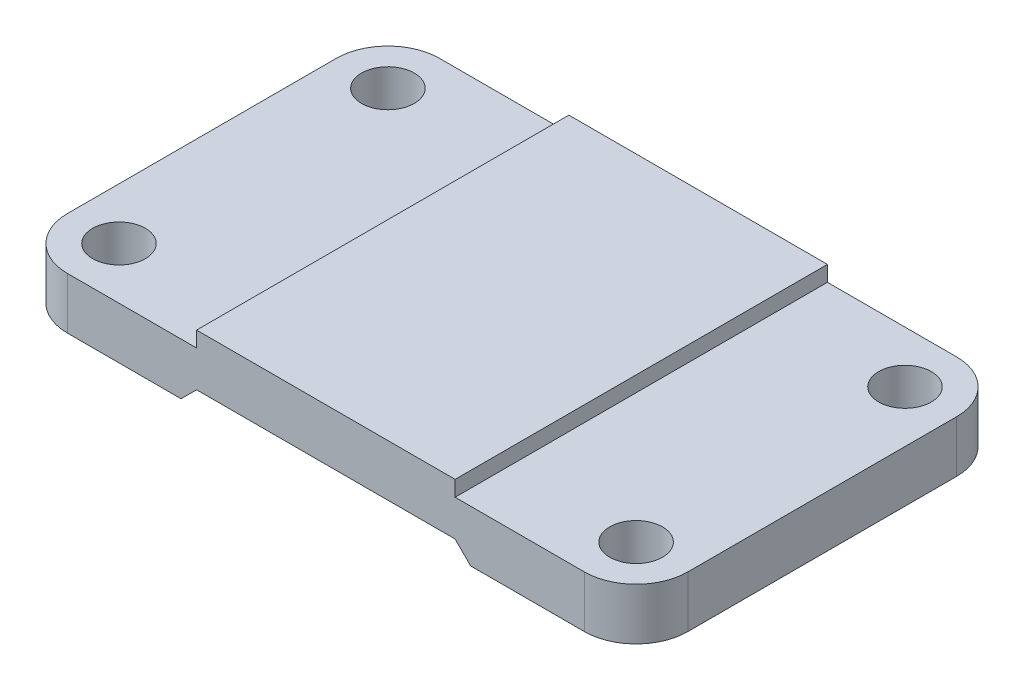
ISO-10303-21;
HEADER;
FILE_DESCRIPTION(('STEP AP214'),'2;1');
FILE_NAME('part.step','',(''),(''),'','','');
FILE_SCHEMA(('AUTOMOTIVE_DESIGN { 1 0 10303 214 1 1 1 1 }'));
ENDSEC;
DATA;
#1=APPLICATION_CONTEXT('core data for automotive mechanical design processes');
#2=APPLICATION_PROTOCOL_DEFINITION('international standard','automotive_design',2000,#1);
#3=PRODUCT_CONTEXT('',#1,'mechanical');
#4=PRODUCT('Part','Part','',(#3));
#5=PRODUCT_RELATED_PRODUCT_CATEGORY('part','',(#4));
#6=PRODUCT_DEFINITION_FORMATION('','',#4);
#7=PRODUCT_DEFINITION_CONTEXT('part definition',#1,'design');
#8=PRODUCT_DEFINITION('design','',#6,#7);
#9=PRODUCT_DEFINITION_SHAPE('','',#8);
#10=(LENGTH_UNIT() NAMED_UNIT(*) SI_UNIT(.MILLI.,.METRE.));
#11=(NAMED_UNIT(*) PLANE_ANGLE_UNIT() SI_UNIT($,.RADIAN.));
#12=(NAMED_UNIT(*) SI_UNIT($,.STERADIAN.) SOLID_ANGLE_UNIT());
#13=UNCERTAINTY_MEASURE_WITH_UNIT(LENGTH_MEASURE(1.E-05),#10,'distance_accuracy_value','');
#14=(GEOMETRIC_REPRESENTATION_CONTEXT(3) GLOBAL_UNCERTAINTY_ASSIGNED_CONTEXT((#13)) GLOBAL_UNIT_ASSIGNED_CONTEXT((#10,
#11,#12)) REPRESENTATION_CONTEXT('',''));
#15=CARTESIAN_POINT('',(0.,0.,0.));
#16=DIRECTION('',(0.,0.,1.));
#17=DIRECTION('',(1.,0.,0.));
#18=AXIS2_PLACEMENT_3D('',#15,#16,#17);
#19=CARTESIAN_POINT('',(0.,0.,0.));
#20=DIRECTION('',(0.,-1.,0.));
#21=DIRECTION('',(0.,0.,-1.));
#22=AXIS2_PLACEMENT_3D('',#19,#20,#21);
#23=PLANE('',#22);
#24=DIRECTION('',(0.,0.,1.));
#25=VECTOR('',#24,1.);
#26=CARTESIAN_POINT('',(-28.,0.,-36.));
#27=LINE('',#26,#25);
#28=CARTESIAN_POINT('',(-28.,0.,-36.));
#29=VERTEX_POINT('',#28);
#30=CARTESIAN_POINT('',(-28.,0.,36.));
#31=VERTEX_POINT('',#30);
#32=EDGE_CURVE('E227',#29,#31,#27,.T.);
#33=ORIENTED_EDGE('',*,*,#32,.T.);
#34=DIRECTION('',(1.,0.,0.));
#35=VECTOR('',#34,1.);
#36=CARTESIAN_POINT('',(-60.,0.,36.));
#37=LINE('',#36,#35);
#38=CARTESIAN_POINT('',(-50.,0.,36.));
#39=VERTEX_POINT('',#38);
#40=EDGE_CURVE('E174',#39,#31,#37,.T.);
#41=ORIENTED_EDGE('',*,*,#40,.F.);
#42=CARTESIAN_POINT('',(-50.,0.,26.));
#43=DIRECTION('',(0.,-1.,0.));
#44=DIRECTION('',(0.,0.,-1.));
#45=AXIS2_PLACEMENT_3D('',#42,#43,#44);
#46=CIRCLE('',#45,10.);
#47=CARTESIAN_POINT('',(-60.,0.,26.));
#48=VERTEX_POINT('',#47);
#49=EDGE_CURVE('E189',#39,#48,#46,.T.);
#50=ORIENTED_EDGE('',*,*,#49,.T.);
#51=DIRECTION('',(0.,0.,1.));
#52=VECTOR('',#51,1.);
#53=CARTESIAN_POINT('',(-60.,0.,36.));
#54=LINE('',#53,#52);
#55=CARTESIAN_POINT('',(-60.,0.,-26.));
#56=VERTEX_POINT('',#55);
#57=EDGE_CURVE('E175',#56,#48,#54,.T.);
#58=ORIENTED_EDGE('',*,*,#57,.F.);
#59=CARTESIAN_POINT('',(-50.,0.,-26.));
#60=DIRECTION('',(0.,-1.,0.));
#61=DIRECTION('',(0.,0.,-1.));
#62=AXIS2_PLACEMENT_3D('',#59,#60,#61);
#63=CIRCLE('',#62,10.);
#64=CARTESIAN_POINT('',(-50.,0.,-36.));
#65=VERTEX_POINT('',#64);
#66=EDGE_CURVE('E194',#56,#65,#63,.T.);
#67=ORIENTED_EDGE('',*,*,#66,.T.);
#68=DIRECTION('',(-1.,0.,0.));
#69=VECTOR('',#68,1.);
#70=CARTESIAN_POINT('',(-60.,0.,-36.));
#71=LINE('',#70,#69);
#72=EDGE_CURVE('E228',#29,#65,#71,.T.);
#73=ORIENTED_EDGE('',*,*,#72,.F.);
#74=EDGE_LOOP('',(#33,#41,#50,#58,#67,#73));
#75=FACE_BOUND('',#74,.T.);
#76=CARTESIAN_POINT('',(-50.,0.,26.));
#77=DIRECTION('',(0.,-1.,0.));
#78=DIRECTION('',(0.,0.,-1.));
#79=AXIS2_PLACEMENT_3D('',#76,#77,#78);
#80=CIRCLE('',#79,6.025);
#81=CARTESIAN_POINT('',(-50.,0.,19.975));
#82=VERTEX_POINT('',#81);
#83=EDGE_CURVE('E290',#82,#82,#80,.T.);
#84=ORIENTED_EDGE('',*,*,#83,.F.);
#85=EDGE_LOOP('',(#84));
#86=FACE_BOUND('',#85,.T.);
#87=CARTESIAN_POINT('',(-50.,0.,-26.));
#88=DIRECTION('',(0.,-1.,0.));
#89=DIRECTION('',(0.,0.,-1.));
#90=AXIS2_PLACEMENT_3D('',#87,#88,#89);
#91=CIRCLE('',#90,6.025);
#92=CARTESIAN_POINT('',(-50.,0.,-32.025));
#93=VERTEX_POINT('',#92);
#94=EDGE_CURVE('E263',#93,#93,#91,.T.);
#95=ORIENTED_EDGE('',*,*,#94,.F.);
#96=EDGE_LOOP('',(#95));
#97=FACE_BOUND('',#96,.T.);
#98=ADVANCED_FACE('F37',(#75,#86,#97),#23,.T.);
#99=CARTESIAN_POINT('',(0.,10.,0.));
#100=DIRECTION('',(0.,-1.,0.));
#101=DIRECTION('',(0.,0.,-1.));
#102=AXIS2_PLACEMENT_3D('',#99,#100,#101);
#103=PLANE('',#102);
#104=CARTESIAN_POINT('',(50.,10.,26.));
#105=DIRECTION('',(0.,-1.,0.));
#106=DIRECTION('',(0.,0.,-1.));
#107=AXIS2_PLACEMENT_3D('',#104,#105,#106);
#108=CIRCLE('',#107,5.1);
#109=CARTESIAN_POINT('',(50.,10.,20.9));
#110=VERTEX_POINT('',#109);
#111=EDGE_CURVE('E287',#110,#110,#108,.T.);
#112=ORIENTED_EDGE('',*,*,#111,.T.);
#113=EDGE_LOOP('',(#112));
#114=FACE_BOUND('',#113,.T.);
#115=CARTESIAN_POINT('',(50.,10.,-26.));
#116=DIRECTION('',(0.,-1.,0.));
#117=DIRECTION('',(0.,0.,-1.));
#118=AXIS2_PLACEMENT_3D('',#115,#116,#117);
#119=CIRCLE('',#118,5.1);
#120=CARTESIAN_POINT('',(50.,10.,-31.1));
#121=VERTEX_POINT('',#120);
#122=EDGE_CURVE('E278',#121,#121,#119,.T.);
#123=ORIENTED_EDGE('',*,*,#122,.T.);
#124=EDGE_LOOP('',(#123));
#125=FACE_BOUND('',#124,.T.);
#126=DIRECTION('',(0.,0.,-1.));
#127=VECTOR('',#126,1.);
#128=CARTESIAN_POINT('',(25.,10.,36.));
#129=LINE('',#128,#127);
#130=CARTESIAN_POINT('',(25.,10.,36.));
#131=VERTEX_POINT('',#130);
#132=CARTESIAN_POINT('',(25.,10.,-36.));
#133=VERTEX_POINT('',#132);
#134=EDGE_CURVE('E60',#131,#133,#129,.T.);
#135=ORIENTED_EDGE('',*,*,#134,.F.);
#136=DIRECTION('',(1.,0.,0.));
#137=VECTOR('',#136,1.);
#138=CARTESIAN_POINT('',(-60.,10.,36.));
#139=LINE('',#138,#137);
#140=CARTESIAN_POINT('',(50.,10.,36.));
#141=VERTEX_POINT('',#140);
#142=EDGE_CURVE('E308',#131,#141,#139,.T.);
#143=ORIENTED_EDGE('',*,*,#142,.T.);
#144=CARTESIAN_POINT('',(50.,10.,26.));
#145=DIRECTION('',(0.,-1.,0.));
#146=DIRECTION('',(0.,0.,-1.));
#147=AXIS2_PLACEMENT_3D('',#144,#145,#146);
#148=CIRCLE('',#147,10.);
#149=CARTESIAN_POINT('',(60.,10.,26.));
#150=VERTEX_POINT('',#149);
#151=EDGE_CURVE('E205',#141,#150,#148,.F.);
#152=ORIENTED_EDGE('',*,*,#151,.T.);
#153=DIRECTION('',(0.,0.,-1.));
#154=VECTOR('',#153,1.);
#155=CARTESIAN_POINT('',(60.,10.,36.));
#156=LINE('',#155,#154);
#157=CARTESIAN_POINT('',(60.,10.,-26.));
#158=VERTEX_POINT('',#157);
#159=EDGE_CURVE('E177',#150,#158,#156,.T.);
#160=ORIENTED_EDGE('',*,*,#159,.T.);
#161=CARTESIAN_POINT('',(50.,10.,-26.));
#162=DIRECTION('',(0.,-1.,0.));
#163=DIRECTION('',(0.,0.,-1.));
#164=AXIS2_PLACEMENT_3D('',#161,#162,#163);
#165=CIRCLE('',#164,10.);
#166=CARTESIAN_POINT('',(50.,10.,-36.));
#167=VERTEX_POINT('',#166);
#168=EDGE_CURVE('E207',#158,#167,#165,.F.);
#169=ORIENTED_EDGE('',*,*,#168,.T.);
#170=DIRECTION('',(-1.,0.,0.));
#171=VECTOR('',#170,1.);
#172=CARTESIAN_POINT('',(-60.,10.,-36.));
#173=LINE('',#172,#171);
#174=EDGE_CURVE('E303',#167,#133,#173,.T.);
#175=ORIENTED_EDGE('',*,*,#174,.T.);
#176=EDGE_LOOP('',(#135,#143,#152,#160,#169,#175));
#177=FACE_BOUND('',#176,.T.);
#178=ADVANCED_FACE('F353',(#114,#125,#177),#103,.F.);
#179=CARTESIAN_POINT('',(-50.,10.,26.));
#180=DIRECTION('',(0.,-1.,0.));
#181=DIRECTION('',(0.,0.,-1.));
#182=AXIS2_PLACEMENT_3D('',#179,#180,#181);
#183=CIRCLE('',#182,5.1);
#184=CARTESIAN_POINT('',(-50.,10.,20.9));
#185=VERTEX_POINT('',#184);
#186=EDGE_CURVE('E296',#185,#185,#183,.T.);
#187=ORIENTED_EDGE('',*,*,#186,.T.);
#188=EDGE_LOOP('',(#187));
#189=FACE_BOUND('',#188,.T.);
#190=CARTESIAN_POINT('',(-50.,10.,-26.));
#191=DIRECTION('',(0.,-1.,0.));
#192=DIRECTION('',(0.,0.,-1.));
#193=AXIS2_PLACEMENT_3D('',#190,#191,#192);
#194=CIRCLE('',#193,5.1);
#195=CARTESIAN_POINT('',(-50.,10.,-31.1));
#196=VERTEX_POINT('',#195);
#197=EDGE_CURVE('E269',#196,#196,#194,.T.);
#198=ORIENTED_EDGE('',*,*,#197,.T.);
#199=EDGE_LOOP('',(#198));
#200=FACE_BOUND('',#199,.T.);
#201=DIRECTION('',(0.,0.,1.));
#202=VECTOR('',#201,1.);
#203=CARTESIAN_POINT('',(-25.,10.,36.));
#204=LINE('',#203,#202);
#205=CARTESIAN_POINT('',(-25.,10.,-36.));
#206=VERTEX_POINT('',#205);
#207=CARTESIAN_POINT('',(-25.,10.,36.));
#208=VERTEX_POINT('',#207);
#209=EDGE_CURVE('E234',#206,#208,#204,.T.);
#210=ORIENTED_EDGE('',*,*,#209,.F.);
#211=CARTESIAN_POINT('',(-50.,10.,-36.));
#212=VERTEX_POINT('',#211);
#213=EDGE_CURVE('E302',#206,#212,#173,.T.);
#214=ORIENTED_EDGE('',*,*,#213,.T.);
#215=CARTESIAN_POINT('',(-50.,10.,-26.));
#216=DIRECTION('',(0.,-1.,0.));
#217=DIRECTION('',(0.,0.,-1.));
#218=AXIS2_PLACEMENT_3D('',#215,#216,#217);
#219=CIRCLE('',#218,10.);
#220=CARTESIAN_POINT('',(-60.,10.,-26.));
#221=VERTEX_POINT('',#220);
#222=EDGE_CURVE('E209',#212,#221,#219,.F.);
#223=ORIENTED_EDGE('',*,*,#222,.T.);
#224=DIRECTION('',(0.,0.,1.));
#225=VECTOR('',#224,1.);
#226=CARTESIAN_POINT('',(-60.,10.,36.));
#227=LINE('',#226,#225);
#228=CARTESIAN_POINT('',(-60.,10.,26.));
#229=VERTEX_POINT('',#228);
#230=EDGE_CURVE('E305',#221,#229,#227,.T.);
#231=ORIENTED_EDGE('',*,*,#230,.T.);
#232=CARTESIAN_POINT('',(-50.,10.,26.));
#233=DIRECTION('',(0.,-1.,0.));
#234=DIRECTION('',(0.,0.,-1.));
#235=AXIS2_PLACEMENT_3D('',#232,#233,#234);
#236=CIRCLE('',#235,10.);
#237=CARTESIAN_POINT('',(-50.,10.,36.));
#238=VERTEX_POINT('',#237);
#239=EDGE_CURVE('E203',#229,#238,#236,.F.);
#240=ORIENTED_EDGE('',*,*,#239,.T.);
#241=EDGE_CURVE('E186',#238,#208,#139,.T.);
#242=ORIENTED_EDGE('',*,*,#241,.T.);
#243=EDGE_LOOP('',(#210,#214,#223,#231,#240,#242));
#244=FACE_BOUND('',#243,.T.);
#245=ADVANCED_FACE('F322',(#189,#200,#244),#103,.F.);
#246=CARTESIAN_POINT('',(60.,10.,36.));
#247=DIRECTION('',(-1.,0.,0.));
#248=DIRECTION('',(0.,0.,1.));
#249=AXIS2_PLACEMENT_3D('',#246,#247,#248);
#250=PLANE('',#249);
#251=DIRECTION('',(0.,0.,-1.));
#252=VECTOR('',#251,1.);
#253=CARTESIAN_POINT('',(60.,0.,36.));
#254=LINE('',#253,#252);
#255=CARTESIAN_POINT('',(60.,0.,26.));
#256=VERTEX_POINT('',#255);
#257=CARTESIAN_POINT('',(60.,0.,-26.));
#258=VERTEX_POINT('',#257);
#259=EDGE_CURVE('E299',#256,#258,#254,.T.);
#260=ORIENTED_EDGE('',*,*,#259,.T.);
#261=DIRECTION('',(0.,-1.,0.));
#262=VECTOR('',#261,1.);
#263=CARTESIAN_POINT('',(60.,10.,-26.));
#264=LINE('',#263,#262);
#265=EDGE_CURVE('E214',#258,#158,#264,.F.);
#266=ORIENTED_EDGE('',*,*,#265,.T.);
#267=ORIENTED_EDGE('',*,*,#159,.F.);
#268=DIRECTION('',(0.,-1.,0.));
#269=VECTOR('',#268,1.);
#270=CARTESIAN_POINT('',(60.,10.,26.));
#271=LINE('',#270,#269);
#272=EDGE_CURVE('E211',#150,#256,#271,.T.);
#273=ORIENTED_EDGE('',*,*,#272,.T.);
#274=EDGE_LOOP('',(#260,#266,#267,#273));
#275=FACE_BOUND('',#274,.T.);
#276=ADVANCED_FACE('F375',(#275),#250,.F.);
#277=CARTESIAN_POINT('',(-60.,10.,-36.));
#278=DIRECTION('',(0.,0.,1.));
#279=DIRECTION('',(1.,0.,0.));
#280=AXIS2_PLACEMENT_3D('',#277,#278,#279);
#281=PLANE('',#280);
#282=DIRECTION('',(-1.,0.,0.));
#283=VECTOR('',#282,1.);
#284=CARTESIAN_POINT('',(-25.,2.99999999999999,-36.));
#285=LINE('',#284,#283);
#286=CARTESIAN_POINT('',(25.,2.99999999999999,-36.));
#287=VERTEX_POINT('',#286);
#288=CARTESIAN_POINT('',(-25.,2.99999999999999,-36.));
#289=VERTEX_POINT('',#288);
#290=EDGE_CURVE('E605',#287,#289,#285,.T.);
#291=ORIENTED_EDGE('',*,*,#290,.T.);
#292=DIRECTION('',(-0.707106781186547,-0.707106781186548,0.));
#293=VECTOR('',#292,1.);
#294=CARTESIAN_POINT('',(-28.,0.,-36.));
#295=LINE('',#294,#293);
#296=EDGE_CURVE('E158',#289,#29,#295,.T.);
#297=ORIENTED_EDGE('',*,*,#296,.T.);
#298=ORIENTED_EDGE('',*,*,#72,.T.);
#299=DIRECTION('',(0.,-1.,0.));
#300=VECTOR('',#299,1.);
#301=CARTESIAN_POINT('',(-50.,10.,-36.));
#302=LINE('',#301,#300);
#303=EDGE_CURVE('E200',#65,#212,#302,.F.);
#304=ORIENTED_EDGE('',*,*,#303,.T.);
#305=ORIENTED_EDGE('',*,*,#213,.F.);
#306=DIRECTION('',(0.,-1.,0.));
#307=VECTOR('',#306,1.);
#308=CARTESIAN_POINT('',(-25.,13.,-36.));
#309=LINE('',#308,#307);
#310=CARTESIAN_POINT('',(-25.,13.,-36.));
#311=VERTEX_POINT('',#310);
#312=EDGE_CURVE('E257',#311,#206,#309,.T.);
#313=ORIENTED_EDGE('',*,*,#312,.F.);
#314=DIRECTION('',(-1.,0.,0.));
#315=VECTOR('',#314,1.);
#316=CARTESIAN_POINT('',(-25.,13.,-36.));
#317=LINE('',#316,#315);
#318=CARTESIAN_POINT('',(25.,13.,-36.));
#319=VERTEX_POINT('',#318);
#320=EDGE_CURVE('E244',#319,#311,#317,.T.);
#321=ORIENTED_EDGE('',*,*,#320,.F.);
#322=DIRECTION('',(0.,-1.,0.));
#323=VECTOR('',#322,1.);
#324=CARTESIAN_POINT('',(25.,13.,-36.));
#325=LINE('',#324,#323);
#326=EDGE_CURVE('E260',#319,#133,#325,.T.);
#327=ORIENTED_EDGE('',*,*,#326,.T.);
#328=ORIENTED_EDGE('',*,*,#174,.F.);
#329=DIRECTION('',(0.,-1.,0.));
#330=VECTOR('',#329,1.);
#331=CARTESIAN_POINT('',(50.,10.,-36.));
#332=LINE('',#331,#330);
#333=CARTESIAN_POINT('',(50.,0.,-36.));
#334=VERTEX_POINT('',#333);
#335=EDGE_CURVE('E197',#167,#334,#332,.T.);
#336=ORIENTED_EDGE('',*,*,#335,.T.);
#337=CARTESIAN_POINT('',(28.,0.,-36.));
#338=VERTEX_POINT('',#337);
#339=EDGE_CURVE('E179',#334,#338,#71,.T.);
#340=ORIENTED_EDGE('',*,*,#339,.T.);
#341=DIRECTION('',(-0.707106781186547,0.707106781186548,0.));
#342=VECTOR('',#341,1.);
#343=CARTESIAN_POINT('',(25.,2.99999999999999,-36.));
#344=LINE('',#343,#342);
#345=EDGE_CURVE('E52',#338,#287,#344,.T.);
#346=ORIENTED_EDGE('',*,*,#345,.T.);
#347=EDGE_LOOP('',(#291,#297,#298,#304,#305,#313,#321,#327,#328,#336,#340,#346));
#348=FACE_BOUND('',#347,.T.);
#349=ADVANCED_FACE('F313',(#348),#281,.F.);
#350=CARTESIAN_POINT('',(-60.,10.,36.));
#351=DIRECTION('',(1.,0.,0.));
#352=DIRECTION('',(0.,0.,-1.));
#353=AXIS2_PLACEMENT_3D('',#350,#351,#352);
#354=PLANE('',#353);
#355=ORIENTED_EDGE('',*,*,#230,.F.);
#356=DIRECTION('',(0.,-1.,0.));
#357=VECTOR('',#356,1.);
#358=CARTESIAN_POINT('',(-60.,10.,-26.));
#359=LINE('',#358,#357);
#360=EDGE_CURVE('E185',#221,#56,#359,.T.);
#361=ORIENTED_EDGE('',*,*,#360,.T.);
#362=ORIENTED_EDGE('',*,*,#57,.T.);
#363=DIRECTION('',(0.,-1.,0.));
#364=VECTOR('',#363,1.);
#365=CARTESIAN_POINT('',(-60.,10.,26.));
#366=LINE('',#365,#364);
#367=EDGE_CURVE('E183',#48,#229,#366,.F.);
#368=ORIENTED_EDGE('',*,*,#367,.T.);
#369=EDGE_LOOP('',(#355,#361,#362,#368));
#370=FACE_BOUND('',#369,.T.);
#371=ADVANCED_FACE('F324',(#370),#354,.F.);
#372=CARTESIAN_POINT('',(-60.,10.,36.));
#373=DIRECTION('',(0.,0.,-1.));
#374=DIRECTION('',(-1.,0.,0.));
#375=AXIS2_PLACEMENT_3D('',#372,#373,#374);
#376=PLANE('',#375);
#377=ORIENTED_EDGE('',*,*,#40,.T.);
#378=DIRECTION('',(-0.707106781186547,-0.707106781186548,0.));
#379=VECTOR('',#378,1.);
#380=CARTESIAN_POINT('',(-28.,0.,36.));
#381=LINE('',#380,#379);
#382=CARTESIAN_POINT('',(-25.,2.99999999999999,36.));
#383=VERTEX_POINT('',#382);
#384=EDGE_CURVE('E606',#383,#31,#381,.T.);
#385=ORIENTED_EDGE('',*,*,#384,.F.);
#386=DIRECTION('',(-1.,0.,0.));
#387=VECTOR('',#386,1.);
#388=CARTESIAN_POINT('',(-25.,2.99999999999999,36.));
#389=LINE('',#388,#387);
#390=CARTESIAN_POINT('',(25.,2.99999999999999,36.));
#391=VERTEX_POINT('',#390);
#392=EDGE_CURVE('E167',#391,#383,#389,.T.);
#393=ORIENTED_EDGE('',*,*,#392,.F.);
#394=DIRECTION('',(-0.707106781186547,0.707106781186548,0.));
#395=VECTOR('',#394,1.);
#396=CARTESIAN_POINT('',(25.,2.99999999999999,36.));
#397=LINE('',#396,#395);
#398=CARTESIAN_POINT('',(28.,0.,36.));
#399=VERTEX_POINT('',#398);
#400=EDGE_CURVE('E151',#399,#391,#397,.T.);
#401=ORIENTED_EDGE('',*,*,#400,.F.);
#402=CARTESIAN_POINT('',(50.,0.,36.));
#403=VERTEX_POINT('',#402);
#404=EDGE_CURVE('E163',#399,#403,#37,.T.);
#405=ORIENTED_EDGE('',*,*,#404,.T.);
#406=DIRECTION('',(0.,-1.,0.));
#407=VECTOR('',#406,1.);
#408=CARTESIAN_POINT('',(50.,10.,36.));
#409=LINE('',#408,#407);
#410=EDGE_CURVE('E11',#403,#141,#409,.F.);
#411=ORIENTED_EDGE('',*,*,#410,.T.);
#412=ORIENTED_EDGE('',*,*,#142,.F.);
#413=DIRECTION('',(0.,-1.,0.));
#414=VECTOR('',#413,1.);
#415=CARTESIAN_POINT('',(25.,13.,36.));
#416=LINE('',#415,#414);
#417=CARTESIAN_POINT('',(25.,13.,36.));
#418=VERTEX_POINT('',#417);
#419=EDGE_CURVE('E249',#418,#131,#416,.T.);
#420=ORIENTED_EDGE('',*,*,#419,.F.);
#421=DIRECTION('',(1.,0.,0.));
#422=VECTOR('',#421,1.);
#423=CARTESIAN_POINT('',(-25.,13.,36.));
#424=LINE('',#423,#422);
#425=CARTESIAN_POINT('',(-25.,13.,36.));
#426=VERTEX_POINT('',#425);
#427=EDGE_CURVE('E248',#426,#418,#424,.T.);
#428=ORIENTED_EDGE('',*,*,#427,.F.);
#429=DIRECTION('',(0.,-1.,0.));
#430=VECTOR('',#429,1.);
#431=CARTESIAN_POINT('',(-25.,13.,36.));
#432=LINE('',#431,#430);
#433=EDGE_CURVE('E255',#426,#208,#432,.T.);
#434=ORIENTED_EDGE('',*,*,#433,.T.);
#435=ORIENTED_EDGE('',*,*,#241,.F.);
#436=DIRECTION('',(0.,-1.,0.));
#437=VECTOR('',#436,1.);
#438=CARTESIAN_POINT('',(-50.,10.,36.));
#439=LINE('',#438,#437);
#440=EDGE_CURVE('E45',#238,#39,#439,.T.);
#441=ORIENTED_EDGE('',*,*,#440,.T.);
#442=EDGE_LOOP('',(#377,#385,#393,#401,#405,#411,#412,#420,#428,#434,#435,#441));
#443=FACE_BOUND('',#442,.T.);
#444=ADVANCED_FACE('F162',(#443),#376,.F.);
#445=DIRECTION('',(0.,0.,1.));
#446=VECTOR('',#445,1.);
#447=CARTESIAN_POINT('',(28.,0.,-36.));
#448=LINE('',#447,#446);
#449=EDGE_CURVE('E148',#338,#399,#448,.T.);
#450=ORIENTED_EDGE('',*,*,#449,.F.);
#451=ORIENTED_EDGE('',*,*,#339,.F.);
#452=CARTESIAN_POINT('',(50.,0.,-26.));
#453=DIRECTION('',(0.,-1.,0.));
#454=DIRECTION('',(0.,0.,-1.));
#455=AXIS2_PLACEMENT_3D('',#452,#453,#454);
#456=CIRCLE('',#455,10.);
#457=EDGE_CURVE('E192',#334,#258,#456,.T.);
#458=ORIENTED_EDGE('',*,*,#457,.T.);
#459=ORIENTED_EDGE('',*,*,#259,.F.);
#460=CARTESIAN_POINT('',(50.,0.,26.));
#461=DIRECTION('',(0.,-1.,0.));
#462=DIRECTION('',(0.,0.,-1.));
#463=AXIS2_PLACEMENT_3D('',#460,#461,#462);
#464=CIRCLE('',#463,10.);
#465=EDGE_CURVE('E172',#256,#403,#464,.T.);
#466=ORIENTED_EDGE('',*,*,#465,.T.);
#467=ORIENTED_EDGE('',*,*,#404,.F.);
#468=EDGE_LOOP('',(#450,#451,#458,#459,#466,#467));
#469=FACE_BOUND('',#468,.T.);
#470=CARTESIAN_POINT('',(50.,0.,-26.));
#471=DIRECTION('',(0.,-1.,0.));
#472=DIRECTION('',(0.,0.,-1.));
#473=AXIS2_PLACEMENT_3D('',#470,#471,#472);
#474=CIRCLE('',#473,6.025);
#475=CARTESIAN_POINT('',(50.,0.,-32.025));
#476=VERTEX_POINT('',#475);
#477=EDGE_CURVE('E272',#476,#476,#474,.T.);
#478=ORIENTED_EDGE('',*,*,#477,.F.);
#479=EDGE_LOOP('',(#478));
#480=FACE_BOUND('',#479,.T.);
#481=CARTESIAN_POINT('',(50.,0.,26.));
#482=DIRECTION('',(0.,-1.,0.));
#483=DIRECTION('',(0.,0.,-1.));
#484=AXIS2_PLACEMENT_3D('',#481,#482,#483);
#485=CIRCLE('',#484,6.025);
#486=CARTESIAN_POINT('',(50.,0.,19.975));
#487=VERTEX_POINT('',#486);
#488=EDGE_CURVE('E281',#487,#487,#485,.T.);
#489=ORIENTED_EDGE('',*,*,#488,.F.);
#490=EDGE_LOOP('',(#489));
#491=FACE_BOUND('',#490,.T.);
#492=ADVANCED_FACE('F169',(#469,#480,#491),#23,.T.);
#493=CARTESIAN_POINT('',(-50.,10.,-26.));
#494=DIRECTION('',(0.,-1.,0.));
#495=DIRECTION('',(0.,0.,-1.));
#496=AXIS2_PLACEMENT_3D('',#493,#494,#495);
#497=CYLINDRICAL_SURFACE('',#496,10.);
#498=ORIENTED_EDGE('',*,*,#222,.F.);
#499=ORIENTED_EDGE('',*,*,#303,.F.);
#500=ORIENTED_EDGE('',*,*,#66,.F.);
#501=ORIENTED_EDGE('',*,*,#360,.F.);
#502=EDGE_LOOP('',(#498,#499,#500,#501));
#503=FACE_BOUND('',#502,.T.);
#504=ADVANCED_FACE('F319',(#503),#497,.T.);
#505=CARTESIAN_POINT('',(50.,10.,-26.));
#506=DIRECTION('',(0.,-1.,0.));
#507=DIRECTION('',(0.,0.,-1.));
#508=AXIS2_PLACEMENT_3D('',#505,#506,#507);
#509=CYLINDRICAL_SURFACE('',#508,10.);
#510=ORIENTED_EDGE('',*,*,#168,.F.);
#511=ORIENTED_EDGE('',*,*,#265,.F.);
#512=ORIENTED_EDGE('',*,*,#457,.F.);
#513=ORIENTED_EDGE('',*,*,#335,.F.);
#514=EDGE_LOOP('',(#510,#511,#512,#513));
#515=FACE_BOUND('',#514,.T.);
#516=ADVANCED_FACE('F366',(#515),#509,.T.);
#517=CARTESIAN_POINT('',(50.,10.,26.));
#518=DIRECTION('',(0.,-1.,0.));
#519=DIRECTION('',(0.,0.,-1.));
#520=AXIS2_PLACEMENT_3D('',#517,#518,#519);
#521=CYLINDRICAL_SURFACE('',#520,10.);
#522=ORIENTED_EDGE('',*,*,#151,.F.);
#523=ORIENTED_EDGE('',*,*,#410,.F.);
#524=ORIENTED_EDGE('',*,*,#465,.F.);
#525=ORIENTED_EDGE('',*,*,#272,.F.);
#526=EDGE_LOOP('',(#522,#523,#524,#525));
#527=FACE_BOUND('',#526,.T.);
#528=ADVANCED_FACE('F380',(#527),#521,.T.);
#529=CARTESIAN_POINT('',(-50.,10.,26.));
#530=DIRECTION('',(0.,-1.,0.));
#531=DIRECTION('',(0.,0.,-1.));
#532=AXIS2_PLACEMENT_3D('',#529,#530,#531);
#533=CYLINDRICAL_SURFACE('',#532,10.);
#534=ORIENTED_EDGE('',*,*,#239,.F.);
#535=ORIENTED_EDGE('',*,*,#367,.F.);
#536=ORIENTED_EDGE('',*,*,#49,.F.);
#537=ORIENTED_EDGE('',*,*,#440,.F.);
#538=EDGE_LOOP('',(#534,#535,#536,#537));
#539=FACE_BOUND('',#538,.T.);
#540=ADVANCED_FACE('F39',(#539),#533,.T.);
#541=CARTESIAN_POINT('',(-50.,0.,26.));
#542=DIRECTION('',(0.,-1.,0.));
#543=DIRECTION('',(0.,0.,-1.));
#544=AXIS2_PLACEMENT_3D('',#541,#542,#543);
#545=CYLINDRICAL_SURFACE('',#544,5.1);
#546=ORIENTED_EDGE('',*,*,#186,.F.);
#547=EDGE_LOOP('',(#546));
#548=FACE_BOUND('',#547,.T.);
#549=CARTESIAN_POINT('',(-50.,0.924999999999998,26.));
#550=DIRECTION('',(0.,-1.,0.));
#551=DIRECTION('',(0.,0.,-1.));
#552=AXIS2_PLACEMENT_3D('',#549,#550,#551);
#553=CIRCLE('',#552,5.1);
#554=CARTESIAN_POINT('',(-50.,0.924999999999998,20.9));
#555=VERTEX_POINT('',#554);
#556=EDGE_CURVE('E293',#555,#555,#553,.T.);
#557=ORIENTED_EDGE('',*,*,#556,.T.);
#558=EDGE_LOOP('',(#557));
#559=FACE_BOUND('',#558,.T.);
#560=ADVANCED_FACE('F387',(#548,#559),#545,.F.);
#561=CARTESIAN_POINT('',(-50.,0.,26.));
#562=DIRECTION('',(0.,-1.,0.));
#563=DIRECTION('',(0.,0.,-1.));
#564=AXIS2_PLACEMENT_3D('',#561,#562,#563);
#565=CONICAL_SURFACE('',#564,6.025,0.78539816339745);
#566=ORIENTED_EDGE('',*,*,#556,.F.);
#567=EDGE_LOOP('',(#566));
#568=FACE_BOUND('',#567,.T.);
#569=ORIENTED_EDGE('',*,*,#83,.T.);
#570=EDGE_LOOP('',(#569));
#571=FACE_BOUND('',#570,.T.);
#572=ADVANCED_FACE('F396',(#568,#571),#565,.F.);
#573=CARTESIAN_POINT('',(50.,0.,26.));
#574=DIRECTION('',(0.,-1.,0.));
#575=DIRECTION('',(0.,0.,-1.));
#576=AXIS2_PLACEMENT_3D('',#573,#574,#575);
#577=CYLINDRICAL_SURFACE('',#576,5.1);
#578=ORIENTED_EDGE('',*,*,#111,.F.);
#579=EDGE_LOOP('',(#578));
#580=FACE_BOUND('',#579,.T.);
#581=CARTESIAN_POINT('',(50.,0.924999999999998,26.));
#582=DIRECTION('',(0.,-1.,0.));
#583=DIRECTION('',(0.,0.,-1.));
#584=AXIS2_PLACEMENT_3D('',#581,#582,#583);
#585=CIRCLE('',#584,5.1);
#586=CARTESIAN_POINT('',(50.,0.924999999999998,20.9));
#587=VERTEX_POINT('',#586);
#588=EDGE_CURVE('E284',#587,#587,#585,.T.);
#589=ORIENTED_EDGE('',*,*,#588,.T.);
#590=EDGE_LOOP('',(#589));
#591=FACE_BOUND('',#590,.T.);
#592=ADVANCED_FACE('F402',(#580,#591),#577,.F.);
#593=CARTESIAN_POINT('',(50.,0.,26.));
#594=DIRECTION('',(0.,-1.,0.));
#595=DIRECTION('',(0.,0.,-1.));
#596=AXIS2_PLACEMENT_3D('',#593,#594,#595);
#597=CONICAL_SURFACE('',#596,6.025,0.78539816339745);
#598=ORIENTED_EDGE('',*,*,#588,.F.);
#599=EDGE_LOOP('',(#598));
#600=FACE_BOUND('',#599,.T.);
#601=ORIENTED_EDGE('',*,*,#488,.T.);
#602=EDGE_LOOP('',(#601));
#603=FACE_BOUND('',#602,.T.);
#604=ADVANCED_FACE('F410',(#600,#603),#597,.F.);
#605=CARTESIAN_POINT('',(50.,0.,-26.));
#606=DIRECTION('',(0.,-1.,0.));
#607=DIRECTION('',(0.,0.,-1.));
#608=AXIS2_PLACEMENT_3D('',#605,#606,#607);
#609=CYLINDRICAL_SURFACE('',#608,5.1);
#610=ORIENTED_EDGE('',*,*,#122,.F.);
#611=EDGE_LOOP('',(#610));
#612=FACE_BOUND('',#611,.T.);
#613=CARTESIAN_POINT('',(50.,0.924999999999998,-26.));
#614=DIRECTION('',(0.,-1.,0.));
#615=DIRECTION('',(0.,0.,-1.));
#616=AXIS2_PLACEMENT_3D('',#613,#614,#615);
#617=CIRCLE('',#616,5.1);
#618=CARTESIAN_POINT('',(50.,0.924999999999998,-31.1));
#619=VERTEX_POINT('',#618);
#620=EDGE_CURVE('E275',#619,#619,#617,.T.);
#621=ORIENTED_EDGE('',*,*,#620,.T.);
#622=EDGE_LOOP('',(#621));
#623=FACE_BOUND('',#622,.T.);
#624=ADVANCED_FACE('F414',(#612,#623),#609,.F.);
#625=CARTESIAN_POINT('',(50.,0.,-26.));
#626=DIRECTION('',(0.,-1.,0.));
#627=DIRECTION('',(0.,0.,-1.));
#628=AXIS2_PLACEMENT_3D('',#625,#626,#627);
#629=CONICAL_SURFACE('',#628,6.025,0.78539816339745);
#630=ORIENTED_EDGE('',*,*,#620,.F.);
#631=EDGE_LOOP('',(#630));
#632=FACE_BOUND('',#631,.T.);
#633=ORIENTED_EDGE('',*,*,#477,.T.);
#634=EDGE_LOOP('',(#633));
#635=FACE_BOUND('',#634,.T.);
#636=ADVANCED_FACE('F418',(#632,#635),#629,.F.);
#637=CARTESIAN_POINT('',(-50.,0.,-26.));
#638=DIRECTION('',(0.,-1.,0.));
#639=DIRECTION('',(0.,0.,-1.));
#640=AXIS2_PLACEMENT_3D('',#637,#638,#639);
#641=CYLINDRICAL_SURFACE('',#640,5.1);
#642=ORIENTED_EDGE('',*,*,#197,.F.);
#643=EDGE_LOOP('',(#642));
#644=FACE_BOUND('',#643,.T.);
#645=CARTESIAN_POINT('',(-50.,0.924999999999998,-26.));
#646=DIRECTION('',(0.,-1.,0.));
#647=DIRECTION('',(0.,0.,-1.));
#648=AXIS2_PLACEMENT_3D('',#645,#646,#647);
#649=CIRCLE('',#648,5.1);
#650=CARTESIAN_POINT('',(-50.,0.924999999999998,-31.1));
#651=VERTEX_POINT('',#650);
#652=EDGE_CURVE('E266',#651,#651,#649,.T.);
#653=ORIENTED_EDGE('',*,*,#652,.T.);
#654=EDGE_LOOP('',(#653));
#655=FACE_BOUND('',#654,.T.);
#656=ADVANCED_FACE('F349',(#644,#655),#641,.F.);
#657=CARTESIAN_POINT('',(-50.,0.,-26.));
#658=DIRECTION('',(0.,-1.,0.));
#659=DIRECTION('',(0.,0.,-1.));
#660=AXIS2_PLACEMENT_3D('',#657,#658,#659);
#661=CONICAL_SURFACE('',#660,6.025,0.78539816339745);
#662=ORIENTED_EDGE('',*,*,#652,.F.);
#663=EDGE_LOOP('',(#662));
#664=FACE_BOUND('',#663,.T.);
#665=ORIENTED_EDGE('',*,*,#94,.T.);
#666=EDGE_LOOP('',(#665));
#667=FACE_BOUND('',#666,.T.);
#668=ADVANCED_FACE('F342',(#664,#667),#661,.F.);
#669=CARTESIAN_POINT('',(25.,13.,36.));
#670=DIRECTION('',(-1.,0.,0.));
#671=DIRECTION('',(0.,0.,1.));
#672=AXIS2_PLACEMENT_3D('',#669,#670,#671);
#673=PLANE('',#672);
#674=ORIENTED_EDGE('',*,*,#134,.T.);
#675=ORIENTED_EDGE('',*,*,#326,.F.);
#676=DIRECTION('',(0.,0.,-1.));
#677=VECTOR('',#676,1.);
#678=CARTESIAN_POINT('',(25.,13.,36.));
#679=LINE('',#678,#677);
#680=EDGE_CURVE('E241',#418,#319,#679,.T.);
#681=ORIENTED_EDGE('',*,*,#680,.F.);
#682=ORIENTED_EDGE('',*,*,#419,.T.);
#683=EDGE_LOOP('',(#674,#675,#681,#682));
#684=FACE_BOUND('',#683,.T.);
#685=ADVANCED_FACE('F340',(#684),#673,.F.);
#686=CARTESIAN_POINT('',(-25.,13.,36.));
#687=DIRECTION('',(1.,0.,0.));
#688=DIRECTION('',(0.,0.,-1.));
#689=AXIS2_PLACEMENT_3D('',#686,#687,#688);
#690=PLANE('',#689);
#691=ORIENTED_EDGE('',*,*,#209,.T.);
#692=ORIENTED_EDGE('',*,*,#433,.F.);
#693=DIRECTION('',(0.,0.,1.));
#694=VECTOR('',#693,1.);
#695=CARTESIAN_POINT('',(-25.,13.,36.));
#696=LINE('',#695,#694);
#697=EDGE_CURVE('E246',#311,#426,#696,.T.);
#698=ORIENTED_EDGE('',*,*,#697,.F.);
#699=ORIENTED_EDGE('',*,*,#312,.T.);
#700=EDGE_LOOP('',(#691,#692,#698,#699));
#701=FACE_BOUND('',#700,.T.);
#702=ADVANCED_FACE('F328',(#701),#690,.F.);
#703=CARTESIAN_POINT('',(0.,13.,0.));
#704=DIRECTION('',(0.,-1.,0.));
#705=DIRECTION('',(0.,0.,-1.));
#706=AXIS2_PLACEMENT_3D('',#703,#704,#705);
#707=PLANE('',#706);
#708=ORIENTED_EDGE('',*,*,#680,.T.);
#709=ORIENTED_EDGE('',*,*,#320,.T.);
#710=ORIENTED_EDGE('',*,*,#697,.T.);
#711=ORIENTED_EDGE('',*,*,#427,.T.);
#712=EDGE_LOOP('',(#708,#709,#710,#711));
#713=FACE_BOUND('',#712,.T.);
#714=ADVANCED_FACE('F335',(#713),#707,.F.);
#715=CARTESIAN_POINT('',(-28.,0.,-36.));
#716=DIRECTION('',(-0.707106781186548,0.707106781186547,0.));
#717=DIRECTION('',(-0.707106781186547,-0.707106781186548,0.));
#718=AXIS2_PLACEMENT_3D('',#715,#716,#717);
#719=PLANE('',#718);
#720=ORIENTED_EDGE('',*,*,#32,.F.);
#721=ORIENTED_EDGE('',*,*,#296,.F.);
#722=DIRECTION('',(0.,0.,1.));
#723=VECTOR('',#722,1.);
#724=CARTESIAN_POINT('',(-25.,2.99999999999999,-36.));
#725=LINE('',#724,#723);
#726=EDGE_CURVE('E232',#289,#383,#725,.T.);
#727=ORIENTED_EDGE('',*,*,#726,.T.);
#728=ORIENTED_EDGE('',*,*,#384,.T.);
#729=EDGE_LOOP('',(#720,#721,#727,#728));
#730=FACE_BOUND('',#729,.T.);
#731=ADVANCED_FACE('F570',(#730),#719,.F.);
#732=CARTESIAN_POINT('',(-25.,2.99999999999999,-36.));
#733=DIRECTION('',(0.,1.,0.));
#734=DIRECTION('',(0.,0.,1.));
#735=AXIS2_PLACEMENT_3D('',#732,#733,#734);
#736=PLANE('',#735);
#737=ORIENTED_EDGE('',*,*,#726,.F.);
#738=ORIENTED_EDGE('',*,*,#290,.F.);
#739=DIRECTION('',(0.,0.,1.));
#740=VECTOR('',#739,1.);
#741=CARTESIAN_POINT('',(25.,2.99999999999999,-36.));
#742=LINE('',#741,#740);
#743=EDGE_CURVE('E157',#287,#391,#742,.T.);
#744=ORIENTED_EDGE('',*,*,#743,.T.);
#745=ORIENTED_EDGE('',*,*,#392,.T.);
#746=EDGE_LOOP('',(#737,#738,#744,#745));
#747=FACE_BOUND('',#746,.T.);
#748=ADVANCED_FACE('F582',(#747),#736,.F.);
#749=CARTESIAN_POINT('',(25.,2.99999999999999,-36.));
#750=DIRECTION('',(0.707106781186548,0.707106781186547,0.));
#751=DIRECTION('',(-0.707106781186547,0.707106781186548,0.));
#752=AXIS2_PLACEMENT_3D('',#749,#750,#751);
#753=PLANE('',#752);
#754=ORIENTED_EDGE('',*,*,#743,.F.);
#755=ORIENTED_EDGE('',*,*,#345,.F.);
#756=ORIENTED_EDGE('',*,*,#449,.T.);
#757=ORIENTED_EDGE('',*,*,#400,.T.);
#758=EDGE_LOOP('',(#754,#755,#756,#757));
#759=FACE_BOUND('',#758,.T.);
#760=ADVANCED_FACE('F150',(#759),#753,.F.);
#761=CLOSED_SHELL('',(#98,#178,#245,#276,#349,#371,#444,#492,#504,#516,#528,#540,#560,#572,#592,
#604,#624,#636,#656,#668,#685,#702,#714,#731,#748,#760));
#762=MANIFOLD_SOLID_BREP('B2',#761);
#763=ADVANCED_BREP_SHAPE_REPRESENTATION('',(#18,#762),#14);
#764=SHAPE_DEFINITION_REPRESENTATION(#9,#763);
ENDSEC;
END-ISO-10303-21;
